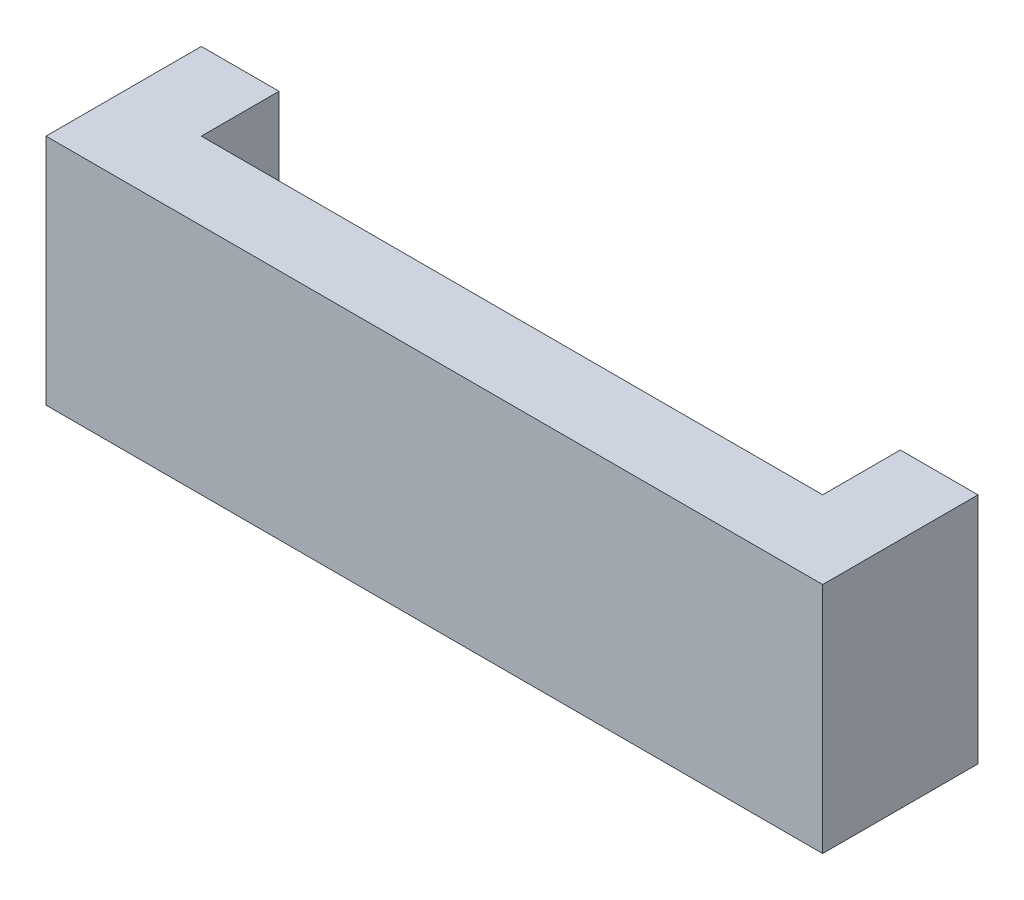
ISO-10303-21;
HEADER;
FILE_DESCRIPTION(('STEP AP214'),'2;1');
FILE_NAME('part.step','',(''),(''),'','','');
FILE_SCHEMA(('AUTOMOTIVE_DESIGN { 1 0 10303 214 1 1 1 1 }'));
ENDSEC;
DATA;
#1=APPLICATION_CONTEXT('core data for automotive mechanical design processes');
#2=APPLICATION_PROTOCOL_DEFINITION('international standard','automotive_design',2000,#1);
#3=PRODUCT_CONTEXT('',#1,'mechanical');
#4=PRODUCT('Part','Part','',(#3));
#5=PRODUCT_RELATED_PRODUCT_CATEGORY('part','',(#4));
#6=PRODUCT_DEFINITION_FORMATION('','',#4);
#7=PRODUCT_DEFINITION_CONTEXT('part definition',#1,'design');
#8=PRODUCT_DEFINITION('design','',#6,#7);
#9=PRODUCT_DEFINITION_SHAPE('','',#8);
#10=(LENGTH_UNIT() NAMED_UNIT(*) SI_UNIT(.MILLI.,.METRE.));
#11=(NAMED_UNIT(*) PLANE_ANGLE_UNIT() SI_UNIT($,.RADIAN.));
#12=(NAMED_UNIT(*) SI_UNIT($,.STERADIAN.) SOLID_ANGLE_UNIT());
#13=UNCERTAINTY_MEASURE_WITH_UNIT(LENGTH_MEASURE(1.E-05),#10,'distance_accuracy_value','');
#14=(GEOMETRIC_REPRESENTATION_CONTEXT(3) GLOBAL_UNCERTAINTY_ASSIGNED_CONTEXT((#13)) GLOBAL_UNIT_ASSIGNED_CONTEXT((#10,
#11,#12)) REPRESENTATION_CONTEXT('',''));
#15=CARTESIAN_POINT('',(0.,0.,0.));
#16=DIRECTION('',(0.,0.,1.));
#17=DIRECTION('',(1.,0.,0.));
#18=AXIS2_PLACEMENT_3D('',#15,#16,#17);
#19=CARTESIAN_POINT('',(-50.,30.,0.));
#20=DIRECTION('',(1.,0.,0.));
#21=DIRECTION('',(0.,0.,-1.));
#22=AXIS2_PLACEMENT_3D('',#19,#20,#21);
#23=PLANE('',#22);
#24=DIRECTION('',(0.,0.,1.));
#25=VECTOR('',#24,1.);
#26=CARTESIAN_POINT('',(-50.,0.,0.));
#27=LINE('',#26,#25);
#28=CARTESIAN_POINT('',(-50.,0.,0.));
#29=VERTEX_POINT('',#28);
#30=CARTESIAN_POINT('',(-50.,0.,20.));
#31=VERTEX_POINT('',#30);
#32=EDGE_CURVE('E140',#29,#31,#27,.T.);
#33=ORIENTED_EDGE('',*,*,#32,.T.);
#34=DIRECTION('',(0.,-1.,0.));
#35=VECTOR('',#34,1.);
#36=CARTESIAN_POINT('',(-50.,30.,20.));
#37=LINE('',#36,#35);
#38=CARTESIAN_POINT('',(-50.,30.,20.));
#39=VERTEX_POINT('',#38);
#40=EDGE_CURVE('E11',#39,#31,#37,.T.);
#41=ORIENTED_EDGE('',*,*,#40,.F.);
#42=DIRECTION('',(0.,0.,1.));
#43=VECTOR('',#42,1.);
#44=CARTESIAN_POINT('',(-50.,30.,0.));
#45=LINE('',#44,#43);
#46=CARTESIAN_POINT('',(-50.,30.,0.));
#47=VERTEX_POINT('',#46);
#48=EDGE_CURVE('E162',#47,#39,#45,.T.);
#49=ORIENTED_EDGE('',*,*,#48,.F.);
#50=DIRECTION('',(0.,-1.,0.));
#51=VECTOR('',#50,1.);
#52=CARTESIAN_POINT('',(-50.,30.,0.));
#53=LINE('',#52,#51);
#54=EDGE_CURVE('E136',#47,#29,#53,.T.);
#55=ORIENTED_EDGE('',*,*,#54,.T.);
#56=EDGE_LOOP('',(#33,#41,#49,#55));
#57=FACE_BOUND('',#56,.T.);
#58=ADVANCED_FACE('F39',(#57),#23,.F.);
#59=CARTESIAN_POINT('',(-50.,30.,20.));
#60=DIRECTION('',(0.,0.,-1.));
#61=DIRECTION('',(-1.,0.,0.));
#62=AXIS2_PLACEMENT_3D('',#59,#60,#61);
#63=PLANE('',#62);
#64=DIRECTION('',(1.,0.,0.));
#65=VECTOR('',#64,1.);
#66=CARTESIAN_POINT('',(-50.,0.,20.));
#67=LINE('',#66,#65);
#68=CARTESIAN_POINT('',(50.,0.,20.));
#69=VERTEX_POINT('',#68);
#70=EDGE_CURVE('E144',#31,#69,#67,.T.);
#71=ORIENTED_EDGE('',*,*,#70,.T.);
#72=DIRECTION('',(0.,-1.,0.));
#73=VECTOR('',#72,1.);
#74=CARTESIAN_POINT('',(50.,30.,20.));
#75=LINE('',#74,#73);
#76=CARTESIAN_POINT('',(50.,30.,20.));
#77=VERTEX_POINT('',#76);
#78=EDGE_CURVE('E48',#77,#69,#75,.T.);
#79=ORIENTED_EDGE('',*,*,#78,.F.);
#80=DIRECTION('',(1.,0.,0.));
#81=VECTOR('',#80,1.);
#82=CARTESIAN_POINT('',(-50.,30.,20.));
#83=LINE('',#82,#81);
#84=EDGE_CURVE('E99',#39,#77,#83,.T.);
#85=ORIENTED_EDGE('',*,*,#84,.F.);
#86=ORIENTED_EDGE('',*,*,#40,.T.);
#87=EDGE_LOOP('',(#71,#79,#85,#86));
#88=FACE_BOUND('',#87,.T.);
#89=ADVANCED_FACE('F208',(#88),#63,.F.);
#90=CARTESIAN_POINT('',(50.,30.,0.));
#91=DIRECTION('',(-1.,0.,0.));
#92=DIRECTION('',(0.,0.,1.));
#93=AXIS2_PLACEMENT_3D('',#90,#91,#92);
#94=PLANE('',#93);
#95=DIRECTION('',(0.,0.,-1.));
#96=VECTOR('',#95,1.);
#97=CARTESIAN_POINT('',(50.,0.,0.));
#98=LINE('',#97,#96);
#99=CARTESIAN_POINT('',(50.,0.,0.));
#100=VERTEX_POINT('',#99);
#101=EDGE_CURVE('E147',#69,#100,#98,.T.);
#102=ORIENTED_EDGE('',*,*,#101,.T.);
#103=DIRECTION('',(0.,-1.,0.));
#104=VECTOR('',#103,1.);
#105=CARTESIAN_POINT('',(50.,30.,0.));
#106=LINE('',#105,#104);
#107=CARTESIAN_POINT('',(50.,30.,0.));
#108=VERTEX_POINT('',#107);
#109=EDGE_CURVE('E173',#108,#100,#106,.T.);
#110=ORIENTED_EDGE('',*,*,#109,.F.);
#111=DIRECTION('',(0.,0.,-1.));
#112=VECTOR('',#111,1.);
#113=CARTESIAN_POINT('',(50.,30.,0.));
#114=LINE('',#113,#112);
#115=EDGE_CURVE('E183',#77,#108,#114,.T.);
#116=ORIENTED_EDGE('',*,*,#115,.F.);
#117=ORIENTED_EDGE('',*,*,#78,.T.);
#118=EDGE_LOOP('',(#102,#110,#116,#117));
#119=FACE_BOUND('',#118,.T.);
#120=ADVANCED_FACE('F181',(#119),#94,.F.);
#121=CARTESIAN_POINT('',(50.,30.,0.));
#122=DIRECTION('',(0.,0.,1.));
#123=DIRECTION('',(1.,0.,0.));
#124=AXIS2_PLACEMENT_3D('',#121,#122,#123);
#125=PLANE('',#124);
#126=DIRECTION('',(-1.,0.,0.));
#127=VECTOR('',#126,1.);
#128=CARTESIAN_POINT('',(50.,0.,0.));
#129=LINE('',#128,#127);
#130=CARTESIAN_POINT('',(40.,0.,0.));
#131=VERTEX_POINT('',#130);
#132=EDGE_CURVE('E150',#100,#131,#129,.T.);
#133=ORIENTED_EDGE('',*,*,#132,.T.);
#134=DIRECTION('',(0.,-1.,0.));
#135=VECTOR('',#134,1.);
#136=CARTESIAN_POINT('',(40.,30.,0.));
#137=LINE('',#136,#135);
#138=CARTESIAN_POINT('',(40.,30.,0.));
#139=VERTEX_POINT('',#138);
#140=EDGE_CURVE('E169',#139,#131,#137,.T.);
#141=ORIENTED_EDGE('',*,*,#140,.F.);
#142=DIRECTION('',(-1.,0.,0.));
#143=VECTOR('',#142,1.);
#144=CARTESIAN_POINT('',(50.,30.,0.));
#145=LINE('',#144,#143);
#146=EDGE_CURVE('E196',#108,#139,#145,.T.);
#147=ORIENTED_EDGE('',*,*,#146,.F.);
#148=ORIENTED_EDGE('',*,*,#109,.T.);
#149=EDGE_LOOP('',(#133,#141,#147,#148));
#150=FACE_BOUND('',#149,.T.);
#151=ADVANCED_FACE('F191',(#150),#125,.F.);
#152=CARTESIAN_POINT('',(40.,30.,0.));
#153=DIRECTION('',(1.,0.,0.));
#154=DIRECTION('',(0.,0.,-1.));
#155=AXIS2_PLACEMENT_3D('',#152,#153,#154);
#156=PLANE('',#155);
#157=DIRECTION('',(0.,0.,1.));
#158=VECTOR('',#157,1.);
#159=CARTESIAN_POINT('',(40.,0.,0.));
#160=LINE('',#159,#158);
#161=CARTESIAN_POINT('',(40.,0.,10.));
#162=VERTEX_POINT('',#161);
#163=EDGE_CURVE('E153',#131,#162,#160,.T.);
#164=ORIENTED_EDGE('',*,*,#163,.T.);
#165=DIRECTION('',(0.,-1.,0.));
#166=VECTOR('',#165,1.);
#167=CARTESIAN_POINT('',(40.,30.,10.));
#168=LINE('',#167,#166);
#169=CARTESIAN_POINT('',(40.,30.,10.));
#170=VERTEX_POINT('',#169);
#171=EDGE_CURVE('E129',#170,#162,#168,.T.);
#172=ORIENTED_EDGE('',*,*,#171,.F.);
#173=DIRECTION('',(0.,0.,1.));
#174=VECTOR('',#173,1.);
#175=CARTESIAN_POINT('',(40.,30.,0.));
#176=LINE('',#175,#174);
#177=EDGE_CURVE('E118',#139,#170,#176,.T.);
#178=ORIENTED_EDGE('',*,*,#177,.F.);
#179=ORIENTED_EDGE('',*,*,#140,.T.);
#180=EDGE_LOOP('',(#164,#172,#178,#179));
#181=FACE_BOUND('',#180,.T.);
#182=ADVANCED_FACE('F194',(#181),#156,.F.);
#183=CARTESIAN_POINT('',(-40.,30.,10.));
#184=DIRECTION('',(0.,0.,1.));
#185=DIRECTION('',(1.,0.,0.));
#186=AXIS2_PLACEMENT_3D('',#183,#184,#185);
#187=PLANE('',#186);
#188=DIRECTION('',(-1.,0.,0.));
#189=VECTOR('',#188,1.);
#190=CARTESIAN_POINT('',(-40.,0.,10.));
#191=LINE('',#190,#189);
#192=CARTESIAN_POINT('',(-40.,0.,10.));
#193=VERTEX_POINT('',#192);
#194=EDGE_CURVE('E127',#162,#193,#191,.T.);
#195=ORIENTED_EDGE('',*,*,#194,.T.);
#196=DIRECTION('',(0.,-1.,0.));
#197=VECTOR('',#196,1.);
#198=CARTESIAN_POINT('',(-40.,30.,10.));
#199=LINE('',#198,#197);
#200=CARTESIAN_POINT('',(-40.,30.,10.));
#201=VERTEX_POINT('',#200);
#202=EDGE_CURVE('E124',#201,#193,#199,.T.);
#203=ORIENTED_EDGE('',*,*,#202,.F.);
#204=DIRECTION('',(-1.,0.,0.));
#205=VECTOR('',#204,1.);
#206=CARTESIAN_POINT('',(-40.,30.,10.));
#207=LINE('',#206,#205);
#208=EDGE_CURVE('E112',#170,#201,#207,.T.);
#209=ORIENTED_EDGE('',*,*,#208,.F.);
#210=ORIENTED_EDGE('',*,*,#171,.T.);
#211=EDGE_LOOP('',(#195,#203,#209,#210));
#212=FACE_BOUND('',#211,.T.);
#213=ADVANCED_FACE('F125',(#212),#187,.F.);
#214=CARTESIAN_POINT('',(-40.,30.,0.));
#215=DIRECTION('',(-1.,0.,0.));
#216=DIRECTION('',(0.,0.,1.));
#217=AXIS2_PLACEMENT_3D('',#214,#215,#216);
#218=PLANE('',#217);
#219=DIRECTION('',(0.,0.,-1.));
#220=VECTOR('',#219,1.);
#221=CARTESIAN_POINT('',(-40.,0.,0.));
#222=LINE('',#221,#220);
#223=CARTESIAN_POINT('',(-40.,0.,0.));
#224=VERTEX_POINT('',#223);
#225=EDGE_CURVE('E85',#193,#224,#222,.T.);
#226=ORIENTED_EDGE('',*,*,#225,.T.);
#227=DIRECTION('',(0.,-1.,0.));
#228=VECTOR('',#227,1.);
#229=CARTESIAN_POINT('',(-40.,30.,0.));
#230=LINE('',#229,#228);
#231=CARTESIAN_POINT('',(-40.,30.,0.));
#232=VERTEX_POINT('',#231);
#233=EDGE_CURVE('E130',#232,#224,#230,.T.);
#234=ORIENTED_EDGE('',*,*,#233,.F.);
#235=DIRECTION('',(0.,0.,-1.));
#236=VECTOR('',#235,1.);
#237=CARTESIAN_POINT('',(-40.,30.,0.));
#238=LINE('',#237,#236);
#239=EDGE_CURVE('E116',#201,#232,#238,.T.);
#240=ORIENTED_EDGE('',*,*,#239,.F.);
#241=ORIENTED_EDGE('',*,*,#202,.T.);
#242=EDGE_LOOP('',(#226,#234,#240,#241));
#243=FACE_BOUND('',#242,.T.);
#244=ADVANCED_FACE('F132',(#243),#218,.F.);
#245=CARTESIAN_POINT('',(-50.,30.,0.));
#246=DIRECTION('',(0.,0.,1.));
#247=DIRECTION('',(1.,0.,0.));
#248=AXIS2_PLACEMENT_3D('',#245,#246,#247);
#249=PLANE('',#248);
#250=DIRECTION('',(-1.,0.,0.));
#251=VECTOR('',#250,1.);
#252=CARTESIAN_POINT('',(-50.,0.,0.));
#253=LINE('',#252,#251);
#254=EDGE_CURVE('E91',#224,#29,#253,.T.);
#255=ORIENTED_EDGE('',*,*,#254,.T.);
#256=ORIENTED_EDGE('',*,*,#54,.F.);
#257=DIRECTION('',(-1.,0.,0.));
#258=VECTOR('',#257,1.);
#259=CARTESIAN_POINT('',(-50.,30.,0.));
#260=LINE('',#259,#258);
#261=EDGE_CURVE('E56',#232,#47,#260,.T.);
#262=ORIENTED_EDGE('',*,*,#261,.F.);
#263=ORIENTED_EDGE('',*,*,#233,.T.);
#264=EDGE_LOOP('',(#255,#256,#262,#263));
#265=FACE_BOUND('',#264,.T.);
#266=ADVANCED_FACE('F224',(#265),#249,.F.);
#267=CARTESIAN_POINT('',(0.,30.,0.));
#268=DIRECTION('',(0.,1.,0.));
#269=DIRECTION('',(0.,0.,1.));
#270=AXIS2_PLACEMENT_3D('',#267,#268,#269);
#271=PLANE('',#270);
#272=ORIENTED_EDGE('',*,*,#48,.T.);
#273=ORIENTED_EDGE('',*,*,#84,.T.);
#274=ORIENTED_EDGE('',*,*,#115,.T.);
#275=ORIENTED_EDGE('',*,*,#146,.T.);
#276=ORIENTED_EDGE('',*,*,#177,.T.);
#277=ORIENTED_EDGE('',*,*,#208,.T.);
#278=ORIENTED_EDGE('',*,*,#239,.T.);
#279=ORIENTED_EDGE('',*,*,#261,.T.);
#280=EDGE_LOOP('',(#272,#273,#274,#275,#276,#277,#278,#279));
#281=FACE_BOUND('',#280,.T.);
#282=ADVANCED_FACE('F114',(#281),#271,.T.);
#283=CARTESIAN_POINT('',(0.,0.,0.));
#284=DIRECTION('',(0.,1.,0.));
#285=DIRECTION('',(0.,0.,1.));
#286=AXIS2_PLACEMENT_3D('',#283,#284,#285);
#287=PLANE('',#286);
#288=ORIENTED_EDGE('',*,*,#32,.F.);
#289=ORIENTED_EDGE('',*,*,#254,.F.);
#290=ORIENTED_EDGE('',*,*,#225,.F.);
#291=ORIENTED_EDGE('',*,*,#194,.F.);
#292=ORIENTED_EDGE('',*,*,#163,.F.);
#293=ORIENTED_EDGE('',*,*,#132,.F.);
#294=ORIENTED_EDGE('',*,*,#101,.F.);
#295=ORIENTED_EDGE('',*,*,#70,.F.);
#296=EDGE_LOOP('',(#288,#289,#290,#291,#292,#293,#294,#295));
#297=FACE_BOUND('',#296,.T.);
#298=ADVANCED_FACE('F187',(#297),#287,.F.);
#299=CLOSED_SHELL('',(#58,#89,#120,#151,#182,#213,#244,#266,#282,#298));
#300=MANIFOLD_SOLID_BREP('B2',#299);
#301=ADVANCED_BREP_SHAPE_REPRESENTATION('',(#18,#300),#14);
#302=SHAPE_DEFINITION_REPRESENTATION(#9,#301);
ENDSEC;
END-ISO-10303-21;
